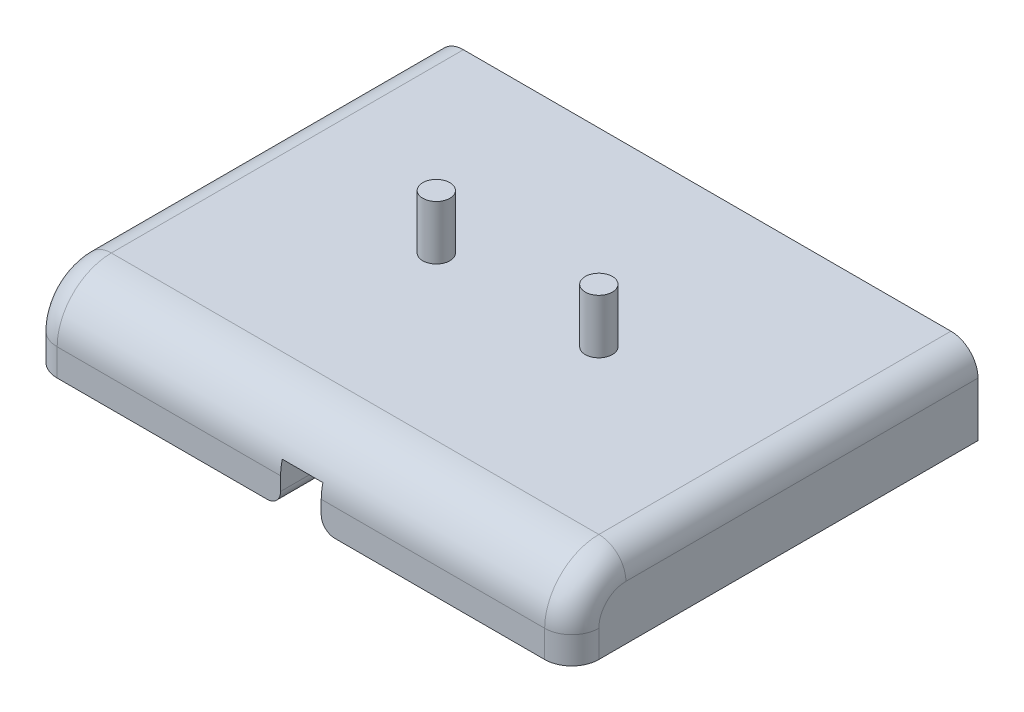
ISO-10303-21;
HEADER;
FILE_DESCRIPTION(('STEP AP214'),'2;1');
FILE_NAME('part.step','',(''),(''),'','','');
FILE_SCHEMA(('AUTOMOTIVE_DESIGN { 1 0 10303 214 1 1 1 1 }'));
ENDSEC;
DATA;
#1=APPLICATION_CONTEXT('core data for automotive mechanical design processes');
#2=APPLICATION_PROTOCOL_DEFINITION('international standard','automotive_design',2000,#1);
#3=PRODUCT_CONTEXT('',#1,'mechanical');
#4=PRODUCT('Part','Part','',(#3));
#5=PRODUCT_RELATED_PRODUCT_CATEGORY('part','',(#4));
#6=PRODUCT_DEFINITION_FORMATION('','',#4);
#7=PRODUCT_DEFINITION_CONTEXT('part definition',#1,'design');
#8=PRODUCT_DEFINITION('design','',#6,#7);
#9=PRODUCT_DEFINITION_SHAPE('','',#8);
#10=(LENGTH_UNIT() NAMED_UNIT(*) SI_UNIT(.MILLI.,.METRE.));
#11=(NAMED_UNIT(*) PLANE_ANGLE_UNIT() SI_UNIT($,.RADIAN.));
#12=(NAMED_UNIT(*) SI_UNIT($,.STERADIAN.) SOLID_ANGLE_UNIT());
#13=UNCERTAINTY_MEASURE_WITH_UNIT(LENGTH_MEASURE(1.E-05),#10,'distance_accuracy_value','');
#14=(GEOMETRIC_REPRESENTATION_CONTEXT(3) GLOBAL_UNCERTAINTY_ASSIGNED_CONTEXT((#13)) GLOBAL_UNIT_ASSIGNED_CONTEXT((#10,
#11,#12)) REPRESENTATION_CONTEXT('',''));
#15=CARTESIAN_POINT('',(0.,0.,0.));
#16=DIRECTION('',(0.,0.,1.));
#17=DIRECTION('',(1.,0.,0.));
#18=AXIS2_PLACEMENT_3D('',#15,#16,#17);
#19=CARTESIAN_POINT('',(-100.,30.,75.));
#20=DIRECTION('',(0.,0.,-1.));
#21=DIRECTION('',(-1.,0.,0.));
#22=AXIS2_PLACEMENT_3D('',#19,#20,#21);
#23=PLANE('',#22);
#24=DIRECTION('',(1.,0.,0.));
#25=VECTOR('',#24,1.);
#26=CARTESIAN_POINT('',(-100.,0.,75.));
#27=LINE('',#26,#25);
#28=CARTESIAN_POINT('',(-90.,0.,75.));
#29=VERTEX_POINT('',#28);
#30=CARTESIAN_POINT('',(-12.5,0.,75.));
#31=VERTEX_POINT('',#30);
#32=EDGE_CURVE('E222',#29,#31,#27,.T.);
#33=ORIENTED_EDGE('',*,*,#32,.T.);
#34=CARTESIAN_POINT('',(-12.5,5.,75.));
#35=DIRECTION('',(0.,0.,-1.));
#36=DIRECTION('',(-1.,0.,0.));
#37=AXIS2_PLACEMENT_3D('',#34,#35,#36);
#38=CIRCLE('',#37,5.);
#39=CARTESIAN_POINT('',(-7.5,5.,75.));
#40=VERTEX_POINT('',#39);
#41=EDGE_CURVE('E68',#31,#40,#38,.F.);
#42=ORIENTED_EDGE('',*,*,#41,.T.);
#43=DIRECTION('',(0.,-1.,0.));
#44=VECTOR('',#43,1.);
#45=CARTESIAN_POINT('',(-7.5,0.,75.));
#46=LINE('',#45,#44);
#47=CARTESIAN_POINT('',(-7.5,10.,75.));
#48=VERTEX_POINT('',#47);
#49=EDGE_CURVE('E200',#48,#40,#46,.T.);
#50=ORIENTED_EDGE('',*,*,#49,.F.);
#51=DIRECTION('',(1.,0.,0.));
#52=VECTOR('',#51,1.);
#53=CARTESIAN_POINT('',(-100.,10.,75.));
#54=LINE('',#53,#52);
#55=CARTESIAN_POINT('',(-90.,10.,75.));
#56=VERTEX_POINT('',#55);
#57=EDGE_CURVE('E243',#48,#56,#54,.F.);
#58=ORIENTED_EDGE('',*,*,#57,.T.);
#59=DIRECTION('',(0.,-1.,0.));
#60=VECTOR('',#59,1.);
#61=CARTESIAN_POINT('',(-90.,30.,75.));
#62=LINE('',#61,#60);
#63=EDGE_CURVE('E284',#56,#29,#62,.T.);
#64=ORIENTED_EDGE('',*,*,#63,.T.);
#65=EDGE_LOOP('',(#33,#42,#50,#58,#64));
#66=FACE_BOUND('',#65,.T.);
#67=ADVANCED_FACE('F52',(#66),#23,.F.);
#68=CARTESIAN_POINT('',(0.,0.,0.));
#69=DIRECTION('',(0.,1.,0.));
#70=DIRECTION('',(0.,0.,1.));
#71=AXIS2_PLACEMENT_3D('',#68,#69,#70);
#72=PLANE('',#71);
#73=DIRECTION('',(1.,0.,0.));
#74=VECTOR('',#73,1.);
#75=CARTESIAN_POINT('',(-100.,0.,-75.));
#76=LINE('',#75,#74);
#77=CARTESIAN_POINT('',(-100.,0.,-75.));
#78=VERTEX_POINT('',#77);
#79=CARTESIAN_POINT('',(-12.5,0.,-75.));
#80=VERTEX_POINT('',#79);
#81=EDGE_CURVE('E215',#78,#80,#76,.T.);
#82=ORIENTED_EDGE('',*,*,#81,.T.);
#83=DIRECTION('',(0.,0.,1.));
#84=VECTOR('',#83,1.);
#85=CARTESIAN_POINT('',(-12.5,0.,0.));
#86=LINE('',#85,#84);
#87=EDGE_CURVE('E335',#80,#31,#86,.T.);
#88=ORIENTED_EDGE('',*,*,#87,.T.);
#89=ORIENTED_EDGE('',*,*,#32,.F.);
#90=CARTESIAN_POINT('',(-90.,0.,65.));
#91=DIRECTION('',(0.,1.,0.));
#92=DIRECTION('',(0.,0.,1.));
#93=AXIS2_PLACEMENT_3D('',#90,#91,#92);
#94=CIRCLE('',#93,10.);
#95=CARTESIAN_POINT('',(-100.,0.,65.));
#96=VERTEX_POINT('',#95);
#97=EDGE_CURVE('E277',#29,#96,#94,.F.);
#98=ORIENTED_EDGE('',*,*,#97,.T.);
#99=DIRECTION('',(0.,0.,1.));
#100=VECTOR('',#99,1.);
#101=CARTESIAN_POINT('',(-100.,0.,-75.));
#102=LINE('',#101,#100);
#103=EDGE_CURVE('E216',#78,#96,#102,.T.);
#104=ORIENTED_EDGE('',*,*,#103,.F.);
#105=EDGE_LOOP('',(#82,#88,#89,#98,#104));
#106=FACE_BOUND('',#105,.T.);
#107=ADVANCED_FACE('F348',(#106),#72,.F.);
#108=CARTESIAN_POINT('',(-100.,30.,-75.));
#109=DIRECTION('',(1.,0.,0.));
#110=DIRECTION('',(0.,0.,-1.));
#111=AXIS2_PLACEMENT_3D('',#108,#109,#110);
#112=PLANE('',#111);
#113=ORIENTED_EDGE('',*,*,#103,.T.);
#114=DIRECTION('',(0.,-1.,0.));
#115=VECTOR('',#114,1.);
#116=CARTESIAN_POINT('',(-100.,30.,65.));
#117=LINE('',#116,#115);
#118=CARTESIAN_POINT('',(-100.,10.,65.));
#119=VERTEX_POINT('',#118);
#120=EDGE_CURVE('E297',#96,#119,#117,.F.);
#121=ORIENTED_EDGE('',*,*,#120,.T.);
#122=CARTESIAN_POINT('',(-100.,10.,55.));
#123=DIRECTION('',(1.,0.,0.));
#124=DIRECTION('',(0.,0.,-1.));
#125=AXIS2_PLACEMENT_3D('',#122,#123,#124);
#126=CIRCLE('',#125,10.);
#127=CARTESIAN_POINT('',(-100.,20.,55.));
#128=VERTEX_POINT('',#127);
#129=EDGE_CURVE('E294',#119,#128,#126,.F.);
#130=ORIENTED_EDGE('',*,*,#129,.T.);
#131=DIRECTION('',(0.,0.,1.));
#132=VECTOR('',#131,1.);
#133=CARTESIAN_POINT('',(-100.,20.,-75.));
#134=LINE('',#133,#132);
#135=CARTESIAN_POINT('',(-100.,20.,-75.));
#136=VERTEX_POINT('',#135);
#137=EDGE_CURVE('E291',#128,#136,#134,.F.);
#138=ORIENTED_EDGE('',*,*,#137,.T.);
#139=DIRECTION('',(0.,-1.,0.));
#140=VECTOR('',#139,1.);
#141=CARTESIAN_POINT('',(-100.,30.,-75.));
#142=LINE('',#141,#140);
#143=EDGE_CURVE('E214',#136,#78,#142,.T.);
#144=ORIENTED_EDGE('',*,*,#143,.T.);
#145=EDGE_LOOP('',(#113,#121,#130,#138,#144));
#146=FACE_BOUND('',#145,.T.);
#147=ADVANCED_FACE('F357',(#146),#112,.F.);
#148=DIRECTION('',(0.,1.,0.));
#149=VECTOR('',#148,1.);
#150=CARTESIAN_POINT('',(7.5,0.,75.));
#151=LINE('',#150,#149);
#152=CARTESIAN_POINT('',(7.5,5.,75.));
#153=VERTEX_POINT('',#152);
#154=CARTESIAN_POINT('',(7.50000000000001,10.,75.));
#155=VERTEX_POINT('',#154);
#156=EDGE_CURVE('E203',#153,#155,#151,.T.);
#157=ORIENTED_EDGE('',*,*,#156,.F.);
#158=CARTESIAN_POINT('',(12.5,5.,75.));
#159=DIRECTION('',(0.,0.,-1.));
#160=DIRECTION('',(-1.,0.,0.));
#161=AXIS2_PLACEMENT_3D('',#158,#159,#160);
#162=CIRCLE('',#161,5.);
#163=CARTESIAN_POINT('',(12.5,0.,75.));
#164=VERTEX_POINT('',#163);
#165=EDGE_CURVE('E324',#153,#164,#162,.F.);
#166=ORIENTED_EDGE('',*,*,#165,.T.);
#167=CARTESIAN_POINT('',(90.,0.,75.));
#168=VERTEX_POINT('',#167);
#169=EDGE_CURVE('E220',#164,#168,#27,.T.);
#170=ORIENTED_EDGE('',*,*,#169,.T.);
#171=DIRECTION('',(0.,-1.,0.));
#172=VECTOR('',#171,1.);
#173=CARTESIAN_POINT('',(90.,10.,75.));
#174=LINE('',#173,#172);
#175=CARTESIAN_POINT('',(90.,10.,75.));
#176=VERTEX_POINT('',#175);
#177=EDGE_CURVE('E288',#168,#176,#174,.F.);
#178=ORIENTED_EDGE('',*,*,#177,.T.);
#179=EDGE_CURVE('E244',#176,#155,#54,.F.);
#180=ORIENTED_EDGE('',*,*,#179,.T.);
#181=EDGE_LOOP('',(#157,#166,#170,#178,#180));
#182=FACE_BOUND('',#181,.T.);
#183=ADVANCED_FACE('F400',(#182),#23,.F.);
#184=CARTESIAN_POINT('',(100.,30.,-75.));
#185=DIRECTION('',(1.,0.,0.));
#186=DIRECTION('',(0.,0.,-1.));
#187=AXIS2_PLACEMENT_3D('',#184,#185,#186);
#188=PLANE('',#187);
#189=DIRECTION('',(0.,-1.,0.));
#190=VECTOR('',#189,1.);
#191=CARTESIAN_POINT('',(100.,30.,-75.));
#192=LINE('',#191,#190);
#193=CARTESIAN_POINT('',(100.,20.,-75.));
#194=VERTEX_POINT('',#193);
#195=CARTESIAN_POINT('',(100.,0.,-75.));
#196=VERTEX_POINT('',#195);
#197=EDGE_CURVE('E235',#194,#196,#192,.T.);
#198=ORIENTED_EDGE('',*,*,#197,.F.);
#199=DIRECTION('',(0.,0.,1.));
#200=VECTOR('',#199,1.);
#201=CARTESIAN_POINT('',(100.,20.,-75.));
#202=LINE('',#201,#200);
#203=CARTESIAN_POINT('',(100.,20.,55.));
#204=VERTEX_POINT('',#203);
#205=EDGE_CURVE('E254',#194,#204,#202,.T.);
#206=ORIENTED_EDGE('',*,*,#205,.T.);
#207=CARTESIAN_POINT('',(100.,10.,55.));
#208=DIRECTION('',(1.,0.,0.));
#209=DIRECTION('',(0.,0.,-1.));
#210=AXIS2_PLACEMENT_3D('',#207,#208,#209);
#211=CIRCLE('',#210,10.);
#212=CARTESIAN_POINT('',(100.,10.,65.));
#213=VERTEX_POINT('',#212);
#214=EDGE_CURVE('E251',#204,#213,#211,.T.);
#215=ORIENTED_EDGE('',*,*,#214,.T.);
#216=DIRECTION('',(0.,-1.,0.));
#217=VECTOR('',#216,1.);
#218=CARTESIAN_POINT('',(100.,0.,65.));
#219=LINE('',#218,#217);
#220=CARTESIAN_POINT('',(100.,0.,65.));
#221=VERTEX_POINT('',#220);
#222=EDGE_CURVE('E248',#213,#221,#219,.T.);
#223=ORIENTED_EDGE('',*,*,#222,.T.);
#224=DIRECTION('',(0.,0.,1.));
#225=VECTOR('',#224,1.);
#226=CARTESIAN_POINT('',(100.,0.,-75.));
#227=LINE('',#226,#225);
#228=EDGE_CURVE('E225',#196,#221,#227,.T.);
#229=ORIENTED_EDGE('',*,*,#228,.F.);
#230=EDGE_LOOP('',(#198,#206,#215,#223,#229));
#231=FACE_BOUND('',#230,.T.);
#232=ADVANCED_FACE('F389',(#231),#188,.T.);
#233=CARTESIAN_POINT('',(-100.,30.,-75.));
#234=DIRECTION('',(0.,0.,-1.));
#235=DIRECTION('',(-1.,0.,0.));
#236=AXIS2_PLACEMENT_3D('',#233,#234,#235);
#237=PLANE('',#236);
#238=CARTESIAN_POINT('',(12.5,0.,-75.));
#239=VERTEX_POINT('',#238);
#240=EDGE_CURVE('E229',#239,#196,#76,.T.);
#241=ORIENTED_EDGE('',*,*,#240,.F.);
#242=CARTESIAN_POINT('',(12.5,5.,-75.));
#243=DIRECTION('',(0.,0.,-1.));
#244=DIRECTION('',(-1.,0.,0.));
#245=AXIS2_PLACEMENT_3D('',#242,#243,#244);
#246=CIRCLE('',#245,5.);
#247=CARTESIAN_POINT('',(7.5,5.,-75.));
#248=VERTEX_POINT('',#247);
#249=EDGE_CURVE('E175',#239,#248,#246,.T.);
#250=ORIENTED_EDGE('',*,*,#249,.T.);
#251=DIRECTION('',(0.,1.,0.));
#252=VECTOR('',#251,1.);
#253=CARTESIAN_POINT('',(7.5,0.,-75.));
#254=LINE('',#253,#252);
#255=CARTESIAN_POINT('',(7.5,15.,-75.));
#256=VERTEX_POINT('',#255);
#257=EDGE_CURVE('E167',#248,#256,#254,.T.);
#258=ORIENTED_EDGE('',*,*,#257,.T.);
#259=DIRECTION('',(-1.,0.,0.));
#260=VECTOR('',#259,1.);
#261=CARTESIAN_POINT('',(-7.5,15.,-75.));
#262=LINE('',#261,#260);
#263=CARTESIAN_POINT('',(-7.5,15.,-75.));
#264=VERTEX_POINT('',#263);
#265=EDGE_CURVE('E173',#256,#264,#262,.T.);
#266=ORIENTED_EDGE('',*,*,#265,.T.);
#267=DIRECTION('',(0.,-1.,0.));
#268=VECTOR('',#267,1.);
#269=CARTESIAN_POINT('',(-7.5,0.,-75.));
#270=LINE('',#269,#268);
#271=CARTESIAN_POINT('',(-7.5,5.,-75.));
#272=VERTEX_POINT('',#271);
#273=EDGE_CURVE('E180',#264,#272,#270,.T.);
#274=ORIENTED_EDGE('',*,*,#273,.T.);
#275=CARTESIAN_POINT('',(-12.5,5.,-75.));
#276=DIRECTION('',(0.,0.,-1.));
#277=DIRECTION('',(-1.,0.,0.));
#278=AXIS2_PLACEMENT_3D('',#275,#276,#277);
#279=CIRCLE('',#278,5.);
#280=EDGE_CURVE('E330',#272,#80,#279,.T.);
#281=ORIENTED_EDGE('',*,*,#280,.T.);
#282=ORIENTED_EDGE('',*,*,#81,.F.);
#283=ORIENTED_EDGE('',*,*,#143,.F.);
#284=CARTESIAN_POINT('',(-90.,20.,-75.));
#285=DIRECTION('',(0.,0.,-1.));
#286=DIRECTION('',(-1.,0.,0.));
#287=AXIS2_PLACEMENT_3D('',#284,#285,#286);
#288=CIRCLE('',#287,10.);
#289=CARTESIAN_POINT('',(-90.,30.,-75.));
#290=VERTEX_POINT('',#289);
#291=EDGE_CURVE('E264',#136,#290,#288,.T.);
#292=ORIENTED_EDGE('',*,*,#291,.T.);
#293=DIRECTION('',(1.,0.,0.));
#294=VECTOR('',#293,1.);
#295=CARTESIAN_POINT('',(-100.,30.,-75.));
#296=LINE('',#295,#294);
#297=CARTESIAN_POINT('',(90.,30.,-75.));
#298=VERTEX_POINT('',#297);
#299=EDGE_CURVE('E210',#290,#298,#296,.T.);
#300=ORIENTED_EDGE('',*,*,#299,.T.);
#301=CARTESIAN_POINT('',(90.,20.,-75.));
#302=DIRECTION('',(0.,0.,-1.));
#303=DIRECTION('',(-1.,0.,0.));
#304=AXIS2_PLACEMENT_3D('',#301,#302,#303);
#305=CIRCLE('',#304,10.);
#306=EDGE_CURVE('E267',#298,#194,#305,.T.);
#307=ORIENTED_EDGE('',*,*,#306,.T.);
#308=ORIENTED_EDGE('',*,*,#197,.T.);
#309=EDGE_LOOP('',(#241,#250,#258,#266,#274,#281,#282,#283,#292,#300,#307,#308));
#310=FACE_BOUND('',#309,.T.);
#311=ADVANCED_FACE('F170',(#310),#237,.T.);
#312=CARTESIAN_POINT('',(0.,30.,0.));
#313=DIRECTION('',(0.,1.,0.));
#314=DIRECTION('',(0.,0.,1.));
#315=AXIS2_PLACEMENT_3D('',#312,#313,#314);
#316=PLANE('',#315);
#317=CARTESIAN_POINT('',(-30.,30.,-4.99999999999999));
#318=DIRECTION('',(0.,1.,0.));
#319=DIRECTION('',(0.,0.,1.));
#320=AXIS2_PLACEMENT_3D('',#317,#318,#319);
#321=CIRCLE('',#320,5.);
#322=CARTESIAN_POINT('',(-30.,30.,0.));
#323=VERTEX_POINT('',#322);
#324=EDGE_CURVE('E13',#323,#323,#321,.T.);
#325=ORIENTED_EDGE('',*,*,#324,.F.);
#326=EDGE_LOOP('',(#325));
#327=FACE_BOUND('',#326,.T.);
#328=CARTESIAN_POINT('',(30.,30.,-4.99999999999999));
#329=DIRECTION('',(0.,1.,0.));
#330=DIRECTION('',(0.,0.,1.));
#331=AXIS2_PLACEMENT_3D('',#328,#329,#330);
#332=CIRCLE('',#331,5.);
#333=CARTESIAN_POINT('',(30.,30.,0.));
#334=VERTEX_POINT('',#333);
#335=EDGE_CURVE('E706',#334,#334,#332,.T.);
#336=ORIENTED_EDGE('',*,*,#335,.F.);
#337=EDGE_LOOP('',(#336));
#338=FACE_BOUND('',#337,.T.);
#339=DIRECTION('',(1.,0.,0.));
#340=VECTOR('',#339,1.);
#341=CARTESIAN_POINT('',(100.,30.,55.));
#342=LINE('',#341,#340);
#343=CARTESIAN_POINT('',(-90.,30.,55.));
#344=VERTEX_POINT('',#343);
#345=CARTESIAN_POINT('',(90.,30.,55.));
#346=VERTEX_POINT('',#345);
#347=EDGE_CURVE('E239',#344,#346,#342,.T.);
#348=ORIENTED_EDGE('',*,*,#347,.T.);
#349=DIRECTION('',(0.,0.,1.));
#350=VECTOR('',#349,1.);
#351=CARTESIAN_POINT('',(90.,30.,0.));
#352=LINE('',#351,#350);
#353=EDGE_CURVE('E261',#346,#298,#352,.F.);
#354=ORIENTED_EDGE('',*,*,#353,.T.);
#355=ORIENTED_EDGE('',*,*,#299,.F.);
#356=DIRECTION('',(0.,0.,1.));
#357=VECTOR('',#356,1.);
#358=CARTESIAN_POINT('',(-90.,30.,55.));
#359=LINE('',#358,#357);
#360=EDGE_CURVE('E258',#290,#344,#359,.T.);
#361=ORIENTED_EDGE('',*,*,#360,.T.);
#362=EDGE_LOOP('',(#348,#354,#355,#361));
#363=FACE_BOUND('',#362,.T.);
#364=ADVANCED_FACE('F370',(#327,#338,#363),#316,.T.);
#365=ORIENTED_EDGE('',*,*,#169,.F.);
#366=DIRECTION('',(0.,0.,1.));
#367=VECTOR('',#366,1.);
#368=CARTESIAN_POINT('',(12.5,0.,0.));
#369=LINE('',#368,#367);
#370=EDGE_CURVE('E327',#164,#239,#369,.F.);
#371=ORIENTED_EDGE('',*,*,#370,.T.);
#372=ORIENTED_EDGE('',*,*,#240,.T.);
#373=ORIENTED_EDGE('',*,*,#228,.T.);
#374=CARTESIAN_POINT('',(90.,0.,65.));
#375=DIRECTION('',(0.,1.,0.));
#376=DIRECTION('',(0.,0.,1.));
#377=AXIS2_PLACEMENT_3D('',#374,#375,#376);
#378=CIRCLE('',#377,10.);
#379=EDGE_CURVE('E280',#221,#168,#378,.F.);
#380=ORIENTED_EDGE('',*,*,#379,.T.);
#381=EDGE_LOOP('',(#365,#371,#372,#373,#380));
#382=FACE_BOUND('',#381,.T.);
#383=ADVANCED_FACE('F394',(#382),#72,.F.);
#384=CARTESIAN_POINT('',(0.,10.,55.));
#385=DIRECTION('',(-1.,0.,0.));
#386=DIRECTION('',(0.,0.,1.));
#387=AXIS2_PLACEMENT_3D('',#384,#385,#386);
#388=CYLINDRICAL_SURFACE('',#387,20.);
#389=CARTESIAN_POINT('',(-7.5,10.,55.));
#390=DIRECTION('',(-1.,0.,0.));
#391=DIRECTION('',(0.,0.,1.));
#392=AXIS2_PLACEMENT_3D('',#389,#390,#391);
#393=CIRCLE('',#392,20.);
#394=CARTESIAN_POINT('',(-7.5,15.,74.3649167310371));
#395=VERTEX_POINT('',#394);
#396=EDGE_CURVE('E318',#395,#48,#393,.F.);
#397=ORIENTED_EDGE('',*,*,#396,.F.);
#398=DIRECTION('',(-1.,0.,0.));
#399=VECTOR('',#398,1.);
#400=CARTESIAN_POINT('',(0.,15.,74.3649167310371));
#401=LINE('',#400,#399);
#402=CARTESIAN_POINT('',(7.5,15.,74.3649167310371));
#403=VERTEX_POINT('',#402);
#404=EDGE_CURVE('E315',#403,#395,#401,.T.);
#405=ORIENTED_EDGE('',*,*,#404,.F.);
#406=CARTESIAN_POINT('',(7.5,10.,55.));
#407=DIRECTION('',(1.,0.,0.));
#408=DIRECTION('',(0.,0.,-1.));
#409=AXIS2_PLACEMENT_3D('',#406,#407,#408);
#410=CIRCLE('',#409,20.);
#411=EDGE_CURVE('E186',#155,#403,#410,.F.);
#412=ORIENTED_EDGE('',*,*,#411,.F.);
#413=ORIENTED_EDGE('',*,*,#179,.F.);
#414=CARTESIAN_POINT('',(90.,10.,55.));
#415=DIRECTION('',(1.,0.,0.));
#416=DIRECTION('',(0.,0.,-1.));
#417=AXIS2_PLACEMENT_3D('',#414,#415,#416);
#418=CIRCLE('',#417,20.);
#419=EDGE_CURVE('E274',#176,#346,#418,.F.);
#420=ORIENTED_EDGE('',*,*,#419,.T.);
#421=ORIENTED_EDGE('',*,*,#347,.F.);
#422=CARTESIAN_POINT('',(-90.,10.,55.));
#423=DIRECTION('',(1.,0.,0.));
#424=DIRECTION('',(0.,0.,-1.));
#425=AXIS2_PLACEMENT_3D('',#422,#423,#424);
#426=CIRCLE('',#425,20.);
#427=EDGE_CURVE('E270',#344,#56,#426,.T.);
#428=ORIENTED_EDGE('',*,*,#427,.T.);
#429=ORIENTED_EDGE('',*,*,#57,.F.);
#430=EDGE_LOOP('',(#397,#405,#412,#413,#420,#421,#428,#429));
#431=FACE_BOUND('',#430,.T.);
#432=ADVANCED_FACE('F374',(#431),#388,.T.);
#433=CARTESIAN_POINT('',(90.,30.,65.));
#434=DIRECTION('',(0.,1.,0.));
#435=DIRECTION('',(0.,0.,1.));
#436=AXIS2_PLACEMENT_3D('',#433,#434,#435);
#437=CYLINDRICAL_SURFACE('',#436,10.);
#438=ORIENTED_EDGE('',*,*,#379,.F.);
#439=ORIENTED_EDGE('',*,*,#222,.F.);
#440=CARTESIAN_POINT('',(90.,10.,65.));
#441=DIRECTION('',(0.,1.,0.));
#442=DIRECTION('',(0.,0.,1.));
#443=AXIS2_PLACEMENT_3D('',#440,#441,#442);
#444=CIRCLE('',#443,10.);
#445=EDGE_CURVE('E221',#176,#213,#444,.T.);
#446=ORIENTED_EDGE('',*,*,#445,.F.);
#447=ORIENTED_EDGE('',*,*,#177,.F.);
#448=EDGE_LOOP('',(#438,#439,#446,#447));
#449=FACE_BOUND('',#448,.T.);
#450=ADVANCED_FACE('F397',(#449),#437,.T.);
#451=CARTESIAN_POINT('',(90.,10.,55.));
#452=DIRECTION('',(1.,0.,0.));
#453=DIRECTION('',(0.,0.,-1.));
#454=AXIS2_PLACEMENT_3D('',#451,#452,#453);
#455=DEGENERATE_TOROIDAL_SURFACE('',#454,10.,10.,.T.);
#456=ORIENTED_EDGE('',*,*,#445,.T.);
#457=ORIENTED_EDGE('',*,*,#214,.F.);
#458=CARTESIAN_POINT('',(90.,20.,55.));
#459=DIRECTION('',(0.,0.,-1.));
#460=DIRECTION('',(-1.,0.,0.));
#461=AXIS2_PLACEMENT_3D('',#458,#459,#460);
#462=CIRCLE('',#461,10.);
#463=EDGE_CURVE('E300',#346,#204,#462,.T.);
#464=ORIENTED_EDGE('',*,*,#463,.F.);
#465=ORIENTED_EDGE('',*,*,#419,.F.);
#466=EDGE_LOOP('',(#456,#457,#464,#465));
#467=FACE_BOUND('',#466,.T.);
#468=ADVANCED_FACE('F380',(#467),#455,.T.);
#469=CARTESIAN_POINT('',(90.,20.,-75.));
#470=DIRECTION('',(0.,0.,1.));
#471=DIRECTION('',(1.,0.,0.));
#472=AXIS2_PLACEMENT_3D('',#469,#470,#471);
#473=CYLINDRICAL_SURFACE('',#472,10.);
#474=ORIENTED_EDGE('',*,*,#306,.F.);
#475=ORIENTED_EDGE('',*,*,#353,.F.);
#476=ORIENTED_EDGE('',*,*,#463,.T.);
#477=ORIENTED_EDGE('',*,*,#205,.F.);
#478=EDGE_LOOP('',(#474,#475,#476,#477));
#479=FACE_BOUND('',#478,.T.);
#480=ADVANCED_FACE('F385',(#479),#473,.T.);
#481=CARTESIAN_POINT('',(-90.,20.,0.));
#482=DIRECTION('',(0.,0.,-1.));
#483=DIRECTION('',(-1.,0.,0.));
#484=AXIS2_PLACEMENT_3D('',#481,#482,#483);
#485=CYLINDRICAL_SURFACE('',#484,10.);
#486=ORIENTED_EDGE('',*,*,#291,.F.);
#487=ORIENTED_EDGE('',*,*,#137,.F.);
#488=CARTESIAN_POINT('',(-90.,20.,55.));
#489=DIRECTION('',(0.,0.,1.));
#490=DIRECTION('',(1.,0.,0.));
#491=AXIS2_PLACEMENT_3D('',#488,#489,#490);
#492=CIRCLE('',#491,10.);
#493=EDGE_CURVE('E303',#344,#128,#492,.T.);
#494=ORIENTED_EDGE('',*,*,#493,.F.);
#495=ORIENTED_EDGE('',*,*,#360,.F.);
#496=EDGE_LOOP('',(#486,#487,#494,#495));
#497=FACE_BOUND('',#496,.T.);
#498=ADVANCED_FACE('F365',(#497),#485,.T.);
#499=CARTESIAN_POINT('',(-90.,10.,55.));
#500=DIRECTION('',(1.,0.,0.));
#501=DIRECTION('',(0.,0.,-1.));
#502=AXIS2_PLACEMENT_3D('',#499,#500,#501);
#503=DEGENERATE_TOROIDAL_SURFACE('',#502,10.,10.,.T.);
#504=ORIENTED_EDGE('',*,*,#493,.T.);
#505=ORIENTED_EDGE('',*,*,#129,.F.);
#506=CARTESIAN_POINT('',(-90.,10.,65.));
#507=DIRECTION('',(0.,-1.,0.));
#508=DIRECTION('',(0.,0.,-1.));
#509=AXIS2_PLACEMENT_3D('',#506,#507,#508);
#510=CIRCLE('',#509,10.);
#511=EDGE_CURVE('E208',#56,#119,#510,.T.);
#512=ORIENTED_EDGE('',*,*,#511,.F.);
#513=ORIENTED_EDGE('',*,*,#427,.F.);
#514=EDGE_LOOP('',(#504,#505,#512,#513));
#515=FACE_BOUND('',#514,.T.);
#516=ADVANCED_FACE('F485',(#515),#503,.T.);
#517=CARTESIAN_POINT('',(-90.,30.,65.));
#518=DIRECTION('',(0.,-1.,0.));
#519=DIRECTION('',(0.,0.,-1.));
#520=AXIS2_PLACEMENT_3D('',#517,#518,#519);
#521=CYLINDRICAL_SURFACE('',#520,10.);
#522=ORIENTED_EDGE('',*,*,#511,.T.);
#523=ORIENTED_EDGE('',*,*,#120,.F.);
#524=ORIENTED_EDGE('',*,*,#97,.F.);
#525=ORIENTED_EDGE('',*,*,#63,.F.);
#526=EDGE_LOOP('',(#522,#523,#524,#525));
#527=FACE_BOUND('',#526,.T.);
#528=ADVANCED_FACE('F353',(#527),#521,.T.);
#529=CARTESIAN_POINT('',(-7.5,0.,-75.));
#530=DIRECTION('',(-1.,0.,0.));
#531=DIRECTION('',(0.,0.,1.));
#532=AXIS2_PLACEMENT_3D('',#529,#530,#531);
#533=PLANE('',#532);
#534=ORIENTED_EDGE('',*,*,#49,.T.);
#535=DIRECTION('',(0.,0.,1.));
#536=VECTOR('',#535,1.);
#537=CARTESIAN_POINT('',(-7.5,5.,-75.));
#538=LINE('',#537,#536);
#539=EDGE_CURVE('E61',#40,#272,#538,.F.);
#540=ORIENTED_EDGE('',*,*,#539,.T.);
#541=ORIENTED_EDGE('',*,*,#273,.F.);
#542=DIRECTION('',(0.,0.,1.));
#543=VECTOR('',#542,1.);
#544=CARTESIAN_POINT('',(-7.5,15.,-75.));
#545=LINE('',#544,#543);
#546=EDGE_CURVE('E190',#264,#395,#545,.T.);
#547=ORIENTED_EDGE('',*,*,#546,.T.);
#548=ORIENTED_EDGE('',*,*,#396,.T.);
#549=EDGE_LOOP('',(#534,#540,#541,#547,#548));
#550=FACE_BOUND('',#549,.T.);
#551=ADVANCED_FACE('F342',(#550),#533,.F.);
#552=CARTESIAN_POINT('',(-7.5,15.,-75.));
#553=DIRECTION('',(0.,1.,0.));
#554=DIRECTION('',(0.,0.,1.));
#555=AXIS2_PLACEMENT_3D('',#552,#553,#554);
#556=PLANE('',#555);
#557=ORIENTED_EDGE('',*,*,#404,.T.);
#558=ORIENTED_EDGE('',*,*,#546,.F.);
#559=ORIENTED_EDGE('',*,*,#265,.F.);
#560=DIRECTION('',(0.,0.,1.));
#561=VECTOR('',#560,1.);
#562=CARTESIAN_POINT('',(7.5,15.,-75.));
#563=LINE('',#562,#561);
#564=EDGE_CURVE('E183',#256,#403,#563,.T.);
#565=ORIENTED_EDGE('',*,*,#564,.T.);
#566=EDGE_LOOP('',(#557,#558,#559,#565));
#567=FACE_BOUND('',#566,.T.);
#568=ADVANCED_FACE('F192',(#567),#556,.F.);
#569=CARTESIAN_POINT('',(7.5,0.,-75.));
#570=DIRECTION('',(1.,0.,0.));
#571=DIRECTION('',(0.,0.,-1.));
#572=AXIS2_PLACEMENT_3D('',#569,#570,#571);
#573=PLANE('',#572);
#574=ORIENTED_EDGE('',*,*,#257,.F.);
#575=DIRECTION('',(0.,0.,1.));
#576=VECTOR('',#575,1.);
#577=CARTESIAN_POINT('',(7.5,5.,-75.));
#578=LINE('',#577,#576);
#579=EDGE_CURVE('E321',#248,#153,#578,.T.);
#580=ORIENTED_EDGE('',*,*,#579,.T.);
#581=ORIENTED_EDGE('',*,*,#156,.T.);
#582=ORIENTED_EDGE('',*,*,#411,.T.);
#583=ORIENTED_EDGE('',*,*,#564,.F.);
#584=EDGE_LOOP('',(#574,#580,#581,#582,#583));
#585=FACE_BOUND('',#584,.T.);
#586=ADVANCED_FACE('F184',(#585),#573,.F.);
#587=CARTESIAN_POINT('',(12.5,5.,-75.));
#588=DIRECTION('',(0.,0.,1.));
#589=DIRECTION('',(1.,0.,0.));
#590=AXIS2_PLACEMENT_3D('',#587,#588,#589);
#591=CYLINDRICAL_SURFACE('',#590,5.);
#592=ORIENTED_EDGE('',*,*,#249,.F.);
#593=ORIENTED_EDGE('',*,*,#370,.F.);
#594=ORIENTED_EDGE('',*,*,#165,.F.);
#595=ORIENTED_EDGE('',*,*,#579,.F.);
#596=EDGE_LOOP('',(#592,#593,#594,#595));
#597=FACE_BOUND('',#596,.T.);
#598=ADVANCED_FACE('F450',(#597),#591,.T.);
#599=CARTESIAN_POINT('',(-12.5,5.,0.));
#600=DIRECTION('',(0.,0.,1.));
#601=DIRECTION('',(1.,0.,0.));
#602=AXIS2_PLACEMENT_3D('',#599,#600,#601);
#603=CYLINDRICAL_SURFACE('',#602,5.);
#604=ORIENTED_EDGE('',*,*,#280,.F.);
#605=ORIENTED_EDGE('',*,*,#539,.F.);
#606=ORIENTED_EDGE('',*,*,#41,.F.);
#607=ORIENTED_EDGE('',*,*,#87,.F.);
#608=EDGE_LOOP('',(#604,#605,#606,#607));
#609=FACE_BOUND('',#608,.T.);
#610=ADVANCED_FACE('F54',(#609),#603,.T.);
#611=CARTESIAN_POINT('',(30.,50.,-4.99999999999999));
#612=DIRECTION('',(0.,-1.,0.));
#613=DIRECTION('',(0.,0.,-1.));
#614=AXIS2_PLACEMENT_3D('',#611,#612,#613);
#615=CYLINDRICAL_SURFACE('',#614,5.);
#616=CARTESIAN_POINT('',(30.,50.,-4.99999999999999));
#617=DIRECTION('',(0.,1.,0.));
#618=DIRECTION('',(0.,0.,1.));
#619=AXIS2_PLACEMENT_3D('',#616,#617,#618);
#620=CIRCLE('',#619,5.);
#621=CARTESIAN_POINT('',(30.,50.,0.));
#622=VERTEX_POINT('',#621);
#623=EDGE_CURVE('E204',#622,#622,#620,.T.);
#624=ORIENTED_EDGE('',*,*,#623,.F.);
#625=EDGE_LOOP('',(#624));
#626=FACE_BOUND('',#625,.T.);
#627=ORIENTED_EDGE('',*,*,#335,.T.);
#628=EDGE_LOOP('',(#627));
#629=FACE_BOUND('',#628,.T.);
#630=ADVANCED_FACE('F456',(#626,#629),#615,.T.);
#631=CARTESIAN_POINT('',(30.,50.,-4.99999999999999));
#632=DIRECTION('',(0.,1.,0.));
#633=DIRECTION('',(0.,0.,1.));
#634=AXIS2_PLACEMENT_3D('',#631,#632,#633);
#635=PLANE('',#634);
#636=ORIENTED_EDGE('',*,*,#623,.T.);
#637=EDGE_LOOP('',(#636));
#638=FACE_BOUND('',#637,.T.);
#639=ADVANCED_FACE('F536',(#638),#635,.T.);
#640=CARTESIAN_POINT('',(-30.,50.,-4.99999999999999));
#641=DIRECTION('',(0.,-1.,0.));
#642=DIRECTION('',(0.,0.,-1.));
#643=AXIS2_PLACEMENT_3D('',#640,#641,#642);
#644=CYLINDRICAL_SURFACE('',#643,5.);
#645=CARTESIAN_POINT('',(-30.,50.,-4.99999999999999));
#646=DIRECTION('',(0.,-1.,0.));
#647=DIRECTION('',(0.,0.,1.));
#648=AXIS2_PLACEMENT_3D('',#645,#646,#647);
#649=CIRCLE('',#648,5.);
#650=CARTESIAN_POINT('',(-30.,50.,0.));
#651=VERTEX_POINT('',#650);
#652=EDGE_CURVE('E709',#651,#651,#649,.T.);
#653=ORIENTED_EDGE('',*,*,#652,.T.);
#654=EDGE_LOOP('',(#653));
#655=FACE_BOUND('',#654,.T.);
#656=ORIENTED_EDGE('',*,*,#324,.T.);
#657=EDGE_LOOP('',(#656));
#658=FACE_BOUND('',#657,.T.);
#659=ADVANCED_FACE('F546',(#655,#658),#644,.T.);
#660=CARTESIAN_POINT('',(-30.,50.,-4.99999999999999));
#661=DIRECTION('',(0.,1.,0.));
#662=DIRECTION('',(0.,0.,1.));
#663=AXIS2_PLACEMENT_3D('',#660,#661,#662);
#664=PLANE('',#663);
#665=ORIENTED_EDGE('',*,*,#652,.F.);
#666=EDGE_LOOP('',(#665));
#667=FACE_BOUND('',#666,.T.);
#668=ADVANCED_FACE('F557',(#667),#664,.T.);
#669=CLOSED_SHELL('',(#67,#107,#147,#183,#232,#311,#364,#383,#432,#450,#468,#480,#498,#516,#528,
#551,#568,#586,#598,#610,#630,#639,#659,#668));
#670=MANIFOLD_SOLID_BREP('B2',#669);
#671=ADVANCED_BREP_SHAPE_REPRESENTATION('',(#18,#670),#14);
#672=SHAPE_DEFINITION_REPRESENTATION(#9,#671);
ENDSEC;
END-ISO-10303-21;
